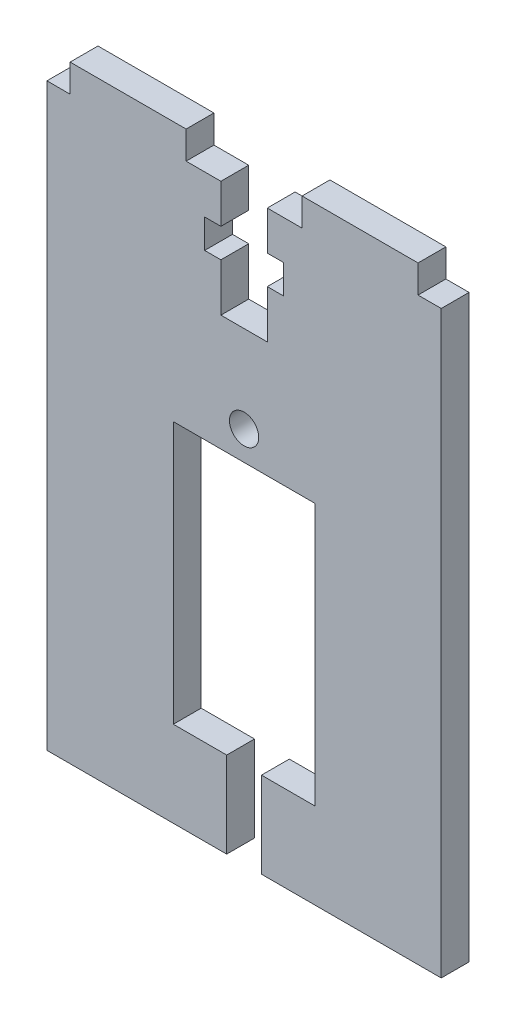
ISO-10303-21;
HEADER;
FILE_DESCRIPTION(('STEP AP214'),'2;1');
FILE_NAME('part.step','',(''),(''),'','','');
FILE_SCHEMA(('AUTOMOTIVE_DESIGN { 1 0 10303 214 1 1 1 1 }'));
ENDSEC;
DATA;
#1=APPLICATION_CONTEXT('core data for automotive mechanical design processes');
#2=APPLICATION_PROTOCOL_DEFINITION('international standard','automotive_design',2000,#1);
#3=PRODUCT_CONTEXT('',#1,'mechanical');
#4=PRODUCT('Part','Part','',(#3));
#5=PRODUCT_RELATED_PRODUCT_CATEGORY('part','',(#4));
#6=PRODUCT_DEFINITION_FORMATION('','',#4);
#7=PRODUCT_DEFINITION_CONTEXT('part definition',#1,'design');
#8=PRODUCT_DEFINITION('design','',#6,#7);
#9=PRODUCT_DEFINITION_SHAPE('','',#8);
#10=(LENGTH_UNIT() NAMED_UNIT(*) SI_UNIT(.MILLI.,.METRE.));
#11=(NAMED_UNIT(*) PLANE_ANGLE_UNIT() SI_UNIT($,.RADIAN.));
#12=(NAMED_UNIT(*) SI_UNIT($,.STERADIAN.) SOLID_ANGLE_UNIT());
#13=UNCERTAINTY_MEASURE_WITH_UNIT(LENGTH_MEASURE(1.E-05),#10,'distance_accuracy_value','');
#14=(GEOMETRIC_REPRESENTATION_CONTEXT(3) GLOBAL_UNCERTAINTY_ASSIGNED_CONTEXT((#13)) GLOBAL_UNIT_ASSIGNED_CONTEXT((#10,
#11,#12)) REPRESENTATION_CONTEXT('',''));
#15=CARTESIAN_POINT('',(0.,0.,0.));
#16=DIRECTION('',(0.,0.,1.));
#17=DIRECTION('',(1.,0.,0.));
#18=AXIS2_PLACEMENT_3D('',#15,#16,#17);
#19=CARTESIAN_POINT('',(-6.1,0.,2.4));
#20=DIRECTION('',(-1.,0.,0.));
#21=DIRECTION('',(0.,0.,1.));
#22=AXIS2_PLACEMENT_3D('',#19,#20,#21);
#23=PLANE('',#22);
#24=DIRECTION('',(0.,1.,0.));
#25=VECTOR('',#24,1.);
#26=CARTESIAN_POINT('',(-6.1,0.,0.));
#27=LINE('',#26,#25);
#28=CARTESIAN_POINT('',(-6.1,-17.0284156869604,0.));
#29=VERTEX_POINT('',#28);
#30=CARTESIAN_POINT('',(-6.1,5.57158431303957,0.));
#31=VERTEX_POINT('',#30);
#32=EDGE_CURVE('E277',#29,#31,#27,.T.);
#33=ORIENTED_EDGE('',*,*,#32,.T.);
#34=DIRECTION('',(0.,0.,-1.));
#35=VECTOR('',#34,1.);
#36=CARTESIAN_POINT('',(-6.1,5.57158431303957,2.4));
#37=LINE('',#36,#35);
#38=CARTESIAN_POINT('',(-6.1,5.57158431303957,2.4));
#39=VERTEX_POINT('',#38);
#40=EDGE_CURVE('E11',#39,#31,#37,.T.);
#41=ORIENTED_EDGE('',*,*,#40,.F.);
#42=DIRECTION('',(0.,1.,0.));
#43=VECTOR('',#42,1.);
#44=CARTESIAN_POINT('',(-6.1,0.,2.4));
#45=LINE('',#44,#43);
#46=CARTESIAN_POINT('',(-6.1,-17.0284156869604,2.4));
#47=VERTEX_POINT('',#46);
#48=EDGE_CURVE('E360',#47,#39,#45,.T.);
#49=ORIENTED_EDGE('',*,*,#48,.F.);
#50=DIRECTION('',(0.,0.,-1.));
#51=VECTOR('',#50,1.);
#52=CARTESIAN_POINT('',(-6.1,-17.0284156869604,2.4));
#53=LINE('',#52,#51);
#54=EDGE_CURVE('E276',#47,#29,#53,.T.);
#55=ORIENTED_EDGE('',*,*,#54,.T.);
#56=EDGE_LOOP('',(#33,#41,#49,#55));
#57=FACE_BOUND('',#56,.T.);
#58=ADVANCED_FACE('F35',(#57),#23,.F.);
#59=CARTESIAN_POINT('',(0.,5.57158431303957,2.4));
#60=DIRECTION('',(0.,1.,0.));
#61=DIRECTION('',(0.,0.,1.));
#62=AXIS2_PLACEMENT_3D('',#59,#60,#61);
#63=PLANE('',#62);
#64=DIRECTION('',(1.,0.,0.));
#65=VECTOR('',#64,1.);
#66=CARTESIAN_POINT('',(0.,5.57158431303957,0.));
#67=LINE('',#66,#65);
#68=CARTESIAN_POINT('',(6.1,5.57158431303957,0.));
#69=VERTEX_POINT('',#68);
#70=EDGE_CURVE('E280',#31,#69,#67,.T.);
#71=ORIENTED_EDGE('',*,*,#70,.T.);
#72=DIRECTION('',(0.,0.,-1.));
#73=VECTOR('',#72,1.);
#74=CARTESIAN_POINT('',(6.1,5.57158431303957,2.4));
#75=LINE('',#74,#73);
#76=CARTESIAN_POINT('',(6.1,5.57158431303957,2.4));
#77=VERTEX_POINT('',#76);
#78=EDGE_CURVE('E43',#77,#69,#75,.T.);
#79=ORIENTED_EDGE('',*,*,#78,.F.);
#80=DIRECTION('',(1.,0.,0.));
#81=VECTOR('',#80,1.);
#82=CARTESIAN_POINT('',(0.,5.57158431303957,2.4));
#83=LINE('',#82,#81);
#84=EDGE_CURVE('E162',#39,#77,#83,.T.);
#85=ORIENTED_EDGE('',*,*,#84,.F.);
#86=ORIENTED_EDGE('',*,*,#40,.T.);
#87=EDGE_LOOP('',(#71,#79,#85,#86));
#88=FACE_BOUND('',#87,.T.);
#89=ADVANCED_FACE('F528',(#88),#63,.F.);
#90=CARTESIAN_POINT('',(6.1,0.,2.4));
#91=DIRECTION('',(1.,0.,0.));
#92=DIRECTION('',(0.,1.,0.));
#93=AXIS2_PLACEMENT_3D('',#90,#91,#92);
#94=PLANE('',#93);
#95=DIRECTION('',(0.,-1.,0.));
#96=VECTOR('',#95,1.);
#97=CARTESIAN_POINT('',(6.1,0.,0.));
#98=LINE('',#97,#96);
#99=CARTESIAN_POINT('',(6.1,-17.0284156869604,0.));
#100=VERTEX_POINT('',#99);
#101=EDGE_CURVE('E282',#69,#100,#98,.T.);
#102=ORIENTED_EDGE('',*,*,#101,.T.);
#103=DIRECTION('',(0.,0.,-1.));
#104=VECTOR('',#103,1.);
#105=CARTESIAN_POINT('',(6.1,-17.0284156869604,2.4));
#106=LINE('',#105,#104);
#107=CARTESIAN_POINT('',(6.1,-17.0284156869604,2.4));
#108=VERTEX_POINT('',#107);
#109=EDGE_CURVE('E423',#108,#100,#106,.T.);
#110=ORIENTED_EDGE('',*,*,#109,.F.);
#111=DIRECTION('',(0.,-1.,0.));
#112=VECTOR('',#111,1.);
#113=CARTESIAN_POINT('',(6.1,0.,2.4));
#114=LINE('',#113,#112);
#115=EDGE_CURVE('E431',#77,#108,#114,.T.);
#116=ORIENTED_EDGE('',*,*,#115,.F.);
#117=ORIENTED_EDGE('',*,*,#78,.T.);
#118=EDGE_LOOP('',(#102,#110,#116,#117));
#119=FACE_BOUND('',#118,.T.);
#120=ADVANCED_FACE('F429',(#119),#94,.F.);
#121=CARTESIAN_POINT('',(0.,-17.0284156869604,2.4));
#122=DIRECTION('',(0.,-1.,0.));
#123=DIRECTION('',(1.,0.,0.));
#124=AXIS2_PLACEMENT_3D('',#121,#122,#123);
#125=PLANE('',#124);
#126=DIRECTION('',(-1.,0.,0.));
#127=VECTOR('',#126,1.);
#128=CARTESIAN_POINT('',(0.,-17.0284156869604,0.));
#129=LINE('',#128,#127);
#130=CARTESIAN_POINT('',(1.5,-17.0284156869604,0.));
#131=VERTEX_POINT('',#130);
#132=EDGE_CURVE('E284',#100,#131,#129,.T.);
#133=ORIENTED_EDGE('',*,*,#132,.T.);
#134=DIRECTION('',(0.,0.,-1.));
#135=VECTOR('',#134,1.);
#136=CARTESIAN_POINT('',(1.5,-17.0284156869604,2.4));
#137=LINE('',#136,#135);
#138=CARTESIAN_POINT('',(1.5,-17.0284156869604,2.4));
#139=VERTEX_POINT('',#138);
#140=EDGE_CURVE('E420',#139,#131,#137,.T.);
#141=ORIENTED_EDGE('',*,*,#140,.F.);
#142=DIRECTION('',(-1.,0.,0.));
#143=VECTOR('',#142,1.);
#144=CARTESIAN_POINT('',(0.,-17.0284156869604,2.4));
#145=LINE('',#144,#143);
#146=EDGE_CURVE('E450',#108,#139,#145,.T.);
#147=ORIENTED_EDGE('',*,*,#146,.F.);
#148=ORIENTED_EDGE('',*,*,#109,.T.);
#149=EDGE_LOOP('',(#133,#141,#147,#148));
#150=FACE_BOUND('',#149,.T.);
#151=ADVANCED_FACE('F441',(#150),#125,.F.);
#152=CARTESIAN_POINT('',(1.5,0.,2.4));
#153=DIRECTION('',(1.,0.,0.));
#154=DIRECTION('',(0.,0.,-1.));
#155=AXIS2_PLACEMENT_3D('',#152,#153,#154);
#156=PLANE('',#155);
#157=DIRECTION('',(0.,-1.,0.));
#158=VECTOR('',#157,1.);
#159=CARTESIAN_POINT('',(1.5,0.,0.));
#160=LINE('',#159,#158);
#161=CARTESIAN_POINT('',(1.5,-24.4284156869604,0.));
#162=VERTEX_POINT('',#161);
#163=EDGE_CURVE('E286',#131,#162,#160,.T.);
#164=ORIENTED_EDGE('',*,*,#163,.T.);
#165=DIRECTION('',(0.,0.,-1.));
#166=VECTOR('',#165,1.);
#167=CARTESIAN_POINT('',(1.5,-24.4284156869604,2.4));
#168=LINE('',#167,#166);
#169=CARTESIAN_POINT('',(1.5,-24.4284156869604,2.4));
#170=VERTEX_POINT('',#169);
#171=EDGE_CURVE('E417',#170,#162,#168,.T.);
#172=ORIENTED_EDGE('',*,*,#171,.F.);
#173=DIRECTION('',(0.,-1.,0.));
#174=VECTOR('',#173,1.);
#175=CARTESIAN_POINT('',(1.5,0.,2.4));
#176=LINE('',#175,#174);
#177=EDGE_CURVE('E447',#139,#170,#176,.T.);
#178=ORIENTED_EDGE('',*,*,#177,.F.);
#179=ORIENTED_EDGE('',*,*,#140,.T.);
#180=EDGE_LOOP('',(#164,#172,#178,#179));
#181=FACE_BOUND('',#180,.T.);
#182=ADVANCED_FACE('F445',(#181),#156,.F.);
#183=CARTESIAN_POINT('',(0.,-24.4284156869604,2.4));
#184=DIRECTION('',(0.,1.,0.));
#185=DIRECTION('',(-1.,0.,0.));
#186=AXIS2_PLACEMENT_3D('',#183,#184,#185);
#187=PLANE('',#186);
#188=DIRECTION('',(1.,0.,0.));
#189=VECTOR('',#188,1.);
#190=CARTESIAN_POINT('',(0.,-24.4284156869604,0.));
#191=LINE('',#190,#189);
#192=CARTESIAN_POINT('',(17.,-24.4284156869604,0.));
#193=VERTEX_POINT('',#192);
#194=EDGE_CURVE('E288',#162,#193,#191,.T.);
#195=ORIENTED_EDGE('',*,*,#194,.T.);
#196=DIRECTION('',(0.,0.,-1.));
#197=VECTOR('',#196,1.);
#198=CARTESIAN_POINT('',(17.,-24.4284156869604,2.4));
#199=LINE('',#198,#197);
#200=CARTESIAN_POINT('',(17.,-24.4284156869604,2.4));
#201=VERTEX_POINT('',#200);
#202=EDGE_CURVE('E415',#201,#193,#199,.T.);
#203=ORIENTED_EDGE('',*,*,#202,.F.);
#204=DIRECTION('',(1.,0.,0.));
#205=VECTOR('',#204,1.);
#206=CARTESIAN_POINT('',(0.,-24.4284156869604,2.4));
#207=LINE('',#206,#205);
#208=EDGE_CURVE('E449',#170,#201,#207,.T.);
#209=ORIENTED_EDGE('',*,*,#208,.F.);
#210=ORIENTED_EDGE('',*,*,#171,.T.);
#211=EDGE_LOOP('',(#195,#203,#209,#210));
#212=FACE_BOUND('',#211,.T.);
#213=ADVANCED_FACE('F541',(#212),#187,.F.);
#214=CARTESIAN_POINT('',(17.,0.,2.4));
#215=DIRECTION('',(1.,0.,0.));
#216=DIRECTION('',(0.,1.,0.));
#217=AXIS2_PLACEMENT_3D('',#214,#215,#216);
#218=PLANE('',#217);
#219=DIRECTION('',(0.,-1.,0.));
#220=VECTOR('',#219,1.);
#221=CARTESIAN_POINT('',(17.,0.,0.));
#222=LINE('',#221,#220);
#223=CARTESIAN_POINT('',(17.,25.5715843130396,0.));
#224=VERTEX_POINT('',#223);
#225=EDGE_CURVE('E291',#224,#193,#222,.T.);
#226=ORIENTED_EDGE('',*,*,#225,.F.);
#227=DIRECTION('',(0.,0.,-1.));
#228=VECTOR('',#227,1.);
#229=CARTESIAN_POINT('',(17.,25.5715843130396,2.4));
#230=LINE('',#229,#228);
#231=CARTESIAN_POINT('',(17.,25.5715843130396,2.4));
#232=VERTEX_POINT('',#231);
#233=EDGE_CURVE('E413',#232,#224,#230,.T.);
#234=ORIENTED_EDGE('',*,*,#233,.F.);
#235=DIRECTION('',(0.,-1.,0.));
#236=VECTOR('',#235,1.);
#237=CARTESIAN_POINT('',(17.,0.,2.4));
#238=LINE('',#237,#236);
#239=EDGE_CURVE('E452',#232,#201,#238,.T.);
#240=ORIENTED_EDGE('',*,*,#239,.T.);
#241=ORIENTED_EDGE('',*,*,#202,.T.);
#242=EDGE_LOOP('',(#226,#234,#240,#241));
#243=FACE_BOUND('',#242,.T.);
#244=ADVANCED_FACE('F544',(#243),#218,.T.);
#245=CARTESIAN_POINT('',(0.,25.5715843130396,2.4));
#246=DIRECTION('',(0.,-1.,0.));
#247=DIRECTION('',(0.,0.,-1.));
#248=AXIS2_PLACEMENT_3D('',#245,#246,#247);
#249=PLANE('',#248);
#250=DIRECTION('',(-1.,0.,0.));
#251=VECTOR('',#250,1.);
#252=CARTESIAN_POINT('',(0.,25.5715843130396,0.));
#253=LINE('',#252,#251);
#254=CARTESIAN_POINT('',(15.,25.5715843130396,0.));
#255=VERTEX_POINT('',#254);
#256=EDGE_CURVE('E294',#224,#255,#253,.T.);
#257=ORIENTED_EDGE('',*,*,#256,.T.);
#258=DIRECTION('',(0.,0.,-1.));
#259=VECTOR('',#258,1.);
#260=CARTESIAN_POINT('',(15.,25.5715843130396,2.4));
#261=LINE('',#260,#259);
#262=CARTESIAN_POINT('',(15.,25.5715843130396,2.4));
#263=VERTEX_POINT('',#262);
#264=EDGE_CURVE('E410',#263,#255,#261,.T.);
#265=ORIENTED_EDGE('',*,*,#264,.F.);
#266=DIRECTION('',(-1.,0.,0.));
#267=VECTOR('',#266,1.);
#268=CARTESIAN_POINT('',(0.,25.5715843130396,2.4));
#269=LINE('',#268,#267);
#270=EDGE_CURVE('E459',#232,#263,#269,.T.);
#271=ORIENTED_EDGE('',*,*,#270,.F.);
#272=ORIENTED_EDGE('',*,*,#233,.T.);
#273=EDGE_LOOP('',(#257,#265,#271,#272));
#274=FACE_BOUND('',#273,.T.);
#275=ADVANCED_FACE('F548',(#274),#249,.F.);
#276=CARTESIAN_POINT('',(15.,0.,2.4));
#277=DIRECTION('',(-1.,0.,0.));
#278=DIRECTION('',(0.,0.,1.));
#279=AXIS2_PLACEMENT_3D('',#276,#277,#278);
#280=PLANE('',#279);
#281=DIRECTION('',(0.,1.,0.));
#282=VECTOR('',#281,1.);
#283=CARTESIAN_POINT('',(15.,0.,0.));
#284=LINE('',#283,#282);
#285=CARTESIAN_POINT('',(15.,27.9715843130396,0.));
#286=VERTEX_POINT('',#285);
#287=EDGE_CURVE('E296',#255,#286,#284,.T.);
#288=ORIENTED_EDGE('',*,*,#287,.T.);
#289=DIRECTION('',(0.,0.,-1.));
#290=VECTOR('',#289,1.);
#291=CARTESIAN_POINT('',(15.,27.9715843130396,2.4));
#292=LINE('',#291,#290);
#293=CARTESIAN_POINT('',(15.,27.9715843130396,2.4));
#294=VERTEX_POINT('',#293);
#295=EDGE_CURVE('E407',#294,#286,#292,.T.);
#296=ORIENTED_EDGE('',*,*,#295,.F.);
#297=DIRECTION('',(0.,1.,0.));
#298=VECTOR('',#297,1.);
#299=CARTESIAN_POINT('',(15.,0.,2.4));
#300=LINE('',#299,#298);
#301=EDGE_CURVE('E461',#263,#294,#300,.T.);
#302=ORIENTED_EDGE('',*,*,#301,.F.);
#303=ORIENTED_EDGE('',*,*,#264,.T.);
#304=EDGE_LOOP('',(#288,#296,#302,#303));
#305=FACE_BOUND('',#304,.T.);
#306=ADVANCED_FACE('F552',(#305),#280,.F.);
#307=CARTESIAN_POINT('',(0.,27.9715843130396,2.4));
#308=DIRECTION('',(0.,-1.,0.));
#309=DIRECTION('',(1.,0.,0.));
#310=AXIS2_PLACEMENT_3D('',#307,#308,#309);
#311=PLANE('',#310);
#312=DIRECTION('',(-1.,0.,0.));
#313=VECTOR('',#312,1.);
#314=CARTESIAN_POINT('',(0.,27.9715843130396,0.));
#315=LINE('',#314,#313);
#316=CARTESIAN_POINT('',(5.,27.9715843130396,0.));
#317=VERTEX_POINT('',#316);
#318=EDGE_CURVE('E298',#286,#317,#315,.T.);
#319=ORIENTED_EDGE('',*,*,#318,.T.);
#320=DIRECTION('',(0.,0.,-1.));
#321=VECTOR('',#320,1.);
#322=CARTESIAN_POINT('',(5.,27.9715843130396,2.4));
#323=LINE('',#322,#321);
#324=CARTESIAN_POINT('',(5.,27.9715843130396,2.4));
#325=VERTEX_POINT('',#324);
#326=EDGE_CURVE('E405',#325,#317,#323,.T.);
#327=ORIENTED_EDGE('',*,*,#326,.F.);
#328=DIRECTION('',(-1.,0.,0.));
#329=VECTOR('',#328,1.);
#330=CARTESIAN_POINT('',(0.,27.9715843130396,2.4));
#331=LINE('',#330,#329);
#332=EDGE_CURVE('E463',#294,#325,#331,.T.);
#333=ORIENTED_EDGE('',*,*,#332,.F.);
#334=ORIENTED_EDGE('',*,*,#295,.T.);
#335=EDGE_LOOP('',(#319,#327,#333,#334));
#336=FACE_BOUND('',#335,.T.);
#337=ADVANCED_FACE('F556',(#336),#311,.F.);
#338=CARTESIAN_POINT('',(5.00000000000002,0.,2.4));
#339=DIRECTION('',(-1.,0.,0.));
#340=DIRECTION('',(0.,-1.,0.));
#341=AXIS2_PLACEMENT_3D('',#338,#339,#340);
#342=PLANE('',#341);
#343=DIRECTION('',(0.,1.,0.));
#344=VECTOR('',#343,1.);
#345=CARTESIAN_POINT('',(5.00000000000002,0.,0.));
#346=LINE('',#345,#344);
#347=CARTESIAN_POINT('',(5.,25.5715843130396,0.));
#348=VERTEX_POINT('',#347);
#349=EDGE_CURVE('E301',#348,#317,#346,.T.);
#350=ORIENTED_EDGE('',*,*,#349,.F.);
#351=DIRECTION('',(0.,0.,-1.));
#352=VECTOR('',#351,1.);
#353=CARTESIAN_POINT('',(5.,25.5715843130396,2.4));
#354=LINE('',#353,#352);
#355=CARTESIAN_POINT('',(5.,25.5715843130396,2.4));
#356=VERTEX_POINT('',#355);
#357=EDGE_CURVE('E403',#356,#348,#354,.T.);
#358=ORIENTED_EDGE('',*,*,#357,.F.);
#359=DIRECTION('',(0.,1.,0.));
#360=VECTOR('',#359,1.);
#361=CARTESIAN_POINT('',(5.00000000000002,0.,2.4));
#362=LINE('',#361,#360);
#363=EDGE_CURVE('E465',#356,#325,#362,.T.);
#364=ORIENTED_EDGE('',*,*,#363,.T.);
#365=ORIENTED_EDGE('',*,*,#326,.T.);
#366=EDGE_LOOP('',(#350,#358,#364,#365));
#367=FACE_BOUND('',#366,.T.);
#368=ADVANCED_FACE('F560',(#367),#342,.T.);
#369=CARTESIAN_POINT('',(0.,25.5715843130396,2.4));
#370=DIRECTION('',(0.,-1.,0.));
#371=DIRECTION('',(1.,0.,0.));
#372=AXIS2_PLACEMENT_3D('',#369,#370,#371);
#373=PLANE('',#372);
#374=DIRECTION('',(-1.,0.,0.));
#375=VECTOR('',#374,1.);
#376=CARTESIAN_POINT('',(0.,25.5715843130396,0.));
#377=LINE('',#376,#375);
#378=CARTESIAN_POINT('',(2.,25.5715843130396,0.));
#379=VERTEX_POINT('',#378);
#380=EDGE_CURVE('E304',#348,#379,#377,.T.);
#381=ORIENTED_EDGE('',*,*,#380,.T.);
#382=DIRECTION('',(0.,0.,-1.));
#383=VECTOR('',#382,1.);
#384=CARTESIAN_POINT('',(2.,25.5715843130396,2.4));
#385=LINE('',#384,#383);
#386=CARTESIAN_POINT('',(2.,25.5715843130396,2.4));
#387=VERTEX_POINT('',#386);
#388=EDGE_CURVE('E400',#387,#379,#385,.T.);
#389=ORIENTED_EDGE('',*,*,#388,.F.);
#390=DIRECTION('',(-1.,0.,0.));
#391=VECTOR('',#390,1.);
#392=CARTESIAN_POINT('',(0.,25.5715843130396,2.4));
#393=LINE('',#392,#391);
#394=EDGE_CURVE('E468',#356,#387,#393,.T.);
#395=ORIENTED_EDGE('',*,*,#394,.F.);
#396=ORIENTED_EDGE('',*,*,#357,.T.);
#397=EDGE_LOOP('',(#381,#389,#395,#396));
#398=FACE_BOUND('',#397,.T.);
#399=ADVANCED_FACE('F564',(#398),#373,.F.);
#400=CARTESIAN_POINT('',(2.00000000000001,0.,2.4));
#401=DIRECTION('',(1.,0.,0.));
#402=DIRECTION('',(0.,1.,0.));
#403=AXIS2_PLACEMENT_3D('',#400,#401,#402);
#404=PLANE('',#403);
#405=DIRECTION('',(0.,-1.,0.));
#406=VECTOR('',#405,1.);
#407=CARTESIAN_POINT('',(2.00000000000001,0.,0.));
#408=LINE('',#407,#406);
#409=CARTESIAN_POINT('',(2.,22.2048061684257,0.));
#410=VERTEX_POINT('',#409);
#411=EDGE_CURVE('E306',#379,#410,#408,.T.);
#412=ORIENTED_EDGE('',*,*,#411,.T.);
#413=DIRECTION('',(0.,0.,-1.));
#414=VECTOR('',#413,1.);
#415=CARTESIAN_POINT('',(2.,22.2048061684257,2.4));
#416=LINE('',#415,#414);
#417=CARTESIAN_POINT('',(2.,22.2048061684257,2.4));
#418=VERTEX_POINT('',#417);
#419=EDGE_CURVE('E398',#418,#410,#416,.T.);
#420=ORIENTED_EDGE('',*,*,#419,.F.);
#421=DIRECTION('',(0.,-1.,0.));
#422=VECTOR('',#421,1.);
#423=CARTESIAN_POINT('',(2.00000000000001,0.,2.4));
#424=LINE('',#423,#422);
#425=EDGE_CURVE('E470',#387,#418,#424,.T.);
#426=ORIENTED_EDGE('',*,*,#425,.F.);
#427=ORIENTED_EDGE('',*,*,#388,.T.);
#428=EDGE_LOOP('',(#412,#420,#426,#427));
#429=FACE_BOUND('',#428,.T.);
#430=ADVANCED_FACE('F568',(#429),#404,.F.);
#431=CARTESIAN_POINT('',(0.,22.2048061684257,2.4));
#432=DIRECTION('',(0.,-1.,0.));
#433=DIRECTION('',(0.,0.,-1.));
#434=AXIS2_PLACEMENT_3D('',#431,#432,#433);
#435=PLANE('',#434);
#436=DIRECTION('',(-1.,0.,0.));
#437=VECTOR('',#436,1.);
#438=CARTESIAN_POINT('',(0.,22.2048061684257,0.));
#439=LINE('',#438,#437);
#440=CARTESIAN_POINT('',(3.4,22.2048061684257,0.));
#441=VERTEX_POINT('',#440);
#442=EDGE_CURVE('E309',#441,#410,#439,.T.);
#443=ORIENTED_EDGE('',*,*,#442,.F.);
#444=DIRECTION('',(0.,0.,-1.));
#445=VECTOR('',#444,1.);
#446=CARTESIAN_POINT('',(3.4,22.2048061684257,2.4));
#447=LINE('',#446,#445);
#448=CARTESIAN_POINT('',(3.4,22.2048061684257,2.4));
#449=VERTEX_POINT('',#448);
#450=EDGE_CURVE('E396',#449,#441,#447,.T.);
#451=ORIENTED_EDGE('',*,*,#450,.F.);
#452=DIRECTION('',(-1.,0.,0.));
#453=VECTOR('',#452,1.);
#454=CARTESIAN_POINT('',(0.,22.2048061684257,2.4));
#455=LINE('',#454,#453);
#456=EDGE_CURVE('E472',#449,#418,#455,.T.);
#457=ORIENTED_EDGE('',*,*,#456,.T.);
#458=ORIENTED_EDGE('',*,*,#419,.T.);
#459=EDGE_LOOP('',(#443,#451,#457,#458));
#460=FACE_BOUND('',#459,.T.);
#461=ADVANCED_FACE('F572',(#460),#435,.T.);
#462=CARTESIAN_POINT('',(3.4,0.,2.4));
#463=DIRECTION('',(1.,0.,0.));
#464=DIRECTION('',(0.,1.,0.));
#465=AXIS2_PLACEMENT_3D('',#462,#463,#464);
#466=PLANE('',#465);
#467=DIRECTION('',(0.,-1.,0.));
#468=VECTOR('',#467,1.);
#469=CARTESIAN_POINT('',(3.4,0.,0.));
#470=LINE('',#469,#468);
#471=CARTESIAN_POINT('',(3.4,19.7048061684257,0.));
#472=VERTEX_POINT('',#471);
#473=EDGE_CURVE('E312',#441,#472,#470,.T.);
#474=ORIENTED_EDGE('',*,*,#473,.T.);
#475=DIRECTION('',(0.,0.,-1.));
#476=VECTOR('',#475,1.);
#477=CARTESIAN_POINT('',(3.4,19.7048061684257,2.4));
#478=LINE('',#477,#476);
#479=CARTESIAN_POINT('',(3.4,19.7048061684257,2.4));
#480=VERTEX_POINT('',#479);
#481=EDGE_CURVE('E393',#480,#472,#478,.T.);
#482=ORIENTED_EDGE('',*,*,#481,.F.);
#483=DIRECTION('',(0.,-1.,0.));
#484=VECTOR('',#483,1.);
#485=CARTESIAN_POINT('',(3.4,0.,2.4));
#486=LINE('',#485,#484);
#487=EDGE_CURVE('E475',#449,#480,#486,.T.);
#488=ORIENTED_EDGE('',*,*,#487,.F.);
#489=ORIENTED_EDGE('',*,*,#450,.T.);
#490=EDGE_LOOP('',(#474,#482,#488,#489));
#491=FACE_BOUND('',#490,.T.);
#492=ADVANCED_FACE('F576',(#491),#466,.F.);
#493=CARTESIAN_POINT('',(0.,19.7048061684257,2.4));
#494=DIRECTION('',(0.,-1.,0.));
#495=DIRECTION('',(0.,0.,-1.));
#496=AXIS2_PLACEMENT_3D('',#493,#494,#495);
#497=PLANE('',#496);
#498=DIRECTION('',(-1.,0.,0.));
#499=VECTOR('',#498,1.);
#500=CARTESIAN_POINT('',(0.,19.7048061684257,0.));
#501=LINE('',#500,#499);
#502=CARTESIAN_POINT('',(2.,19.7048061684257,0.));
#503=VERTEX_POINT('',#502);
#504=EDGE_CURVE('E314',#472,#503,#501,.T.);
#505=ORIENTED_EDGE('',*,*,#504,.T.);
#506=DIRECTION('',(0.,0.,-1.));
#507=VECTOR('',#506,1.);
#508=CARTESIAN_POINT('',(2.,19.7048061684257,2.4));
#509=LINE('',#508,#507);
#510=CARTESIAN_POINT('',(2.,19.7048061684257,2.4));
#511=VERTEX_POINT('',#510);
#512=EDGE_CURVE('E390',#511,#503,#509,.T.);
#513=ORIENTED_EDGE('',*,*,#512,.F.);
#514=DIRECTION('',(-1.,0.,0.));
#515=VECTOR('',#514,1.);
#516=CARTESIAN_POINT('',(0.,19.7048061684257,2.4));
#517=LINE('',#516,#515);
#518=EDGE_CURVE('E477',#480,#511,#517,.T.);
#519=ORIENTED_EDGE('',*,*,#518,.F.);
#520=ORIENTED_EDGE('',*,*,#481,.T.);
#521=EDGE_LOOP('',(#505,#513,#519,#520));
#522=FACE_BOUND('',#521,.T.);
#523=ADVANCED_FACE('F580',(#522),#497,.F.);
#524=CARTESIAN_POINT('',(2.00000000000001,0.,2.4));
#525=DIRECTION('',(1.,0.,0.));
#526=DIRECTION('',(0.,1.,0.));
#527=AXIS2_PLACEMENT_3D('',#524,#525,#526);
#528=PLANE('',#527);
#529=DIRECTION('',(0.,-1.,0.));
#530=VECTOR('',#529,1.);
#531=CARTESIAN_POINT('',(2.00000000000001,0.,0.));
#532=LINE('',#531,#530);
#533=CARTESIAN_POINT('',(2.,15.5715843130396,0.));
#534=VERTEX_POINT('',#533);
#535=EDGE_CURVE('E316',#503,#534,#532,.T.);
#536=ORIENTED_EDGE('',*,*,#535,.T.);
#537=DIRECTION('',(0.,0.,-1.));
#538=VECTOR('',#537,1.);
#539=CARTESIAN_POINT('',(2.,15.5715843130396,2.4));
#540=LINE('',#539,#538);
#541=CARTESIAN_POINT('',(2.,15.5715843130396,2.4));
#542=VERTEX_POINT('',#541);
#543=EDGE_CURVE('E387',#542,#534,#540,.T.);
#544=ORIENTED_EDGE('',*,*,#543,.F.);
#545=DIRECTION('',(0.,-1.,0.));
#546=VECTOR('',#545,1.);
#547=CARTESIAN_POINT('',(2.00000000000001,0.,2.4));
#548=LINE('',#547,#546);
#549=EDGE_CURVE('E479',#511,#542,#548,.T.);
#550=ORIENTED_EDGE('',*,*,#549,.F.);
#551=ORIENTED_EDGE('',*,*,#512,.T.);
#552=EDGE_LOOP('',(#536,#544,#550,#551));
#553=FACE_BOUND('',#552,.T.);
#554=ADVANCED_FACE('F584',(#553),#528,.F.);
#555=CARTESIAN_POINT('',(0.,15.5715843130396,2.4));
#556=DIRECTION('',(0.,-1.,0.));
#557=DIRECTION('',(0.,0.,-1.));
#558=AXIS2_PLACEMENT_3D('',#555,#556,#557);
#559=PLANE('',#558);
#560=DIRECTION('',(-1.,0.,0.));
#561=VECTOR('',#560,1.);
#562=CARTESIAN_POINT('',(0.,15.5715843130396,0.));
#563=LINE('',#562,#561);
#564=CARTESIAN_POINT('',(-2.,15.5715843130396,0.));
#565=VERTEX_POINT('',#564);
#566=EDGE_CURVE('E318',#534,#565,#563,.T.);
#567=ORIENTED_EDGE('',*,*,#566,.T.);
#568=DIRECTION('',(0.,0.,-1.));
#569=VECTOR('',#568,1.);
#570=CARTESIAN_POINT('',(-2.,15.5715843130396,2.4));
#571=LINE('',#570,#569);
#572=CARTESIAN_POINT('',(-2.,15.5715843130396,2.4));
#573=VERTEX_POINT('',#572);
#574=EDGE_CURVE('E385',#573,#565,#571,.T.);
#575=ORIENTED_EDGE('',*,*,#574,.F.);
#576=DIRECTION('',(-1.,0.,0.));
#577=VECTOR('',#576,1.);
#578=CARTESIAN_POINT('',(0.,15.5715843130396,2.4));
#579=LINE('',#578,#577);
#580=EDGE_CURVE('E481',#542,#573,#579,.T.);
#581=ORIENTED_EDGE('',*,*,#580,.F.);
#582=ORIENTED_EDGE('',*,*,#543,.T.);
#583=EDGE_LOOP('',(#567,#575,#581,#582));
#584=FACE_BOUND('',#583,.T.);
#585=ADVANCED_FACE('F588',(#584),#559,.F.);
#586=CARTESIAN_POINT('',(-1.99999999999999,0.,2.4));
#587=DIRECTION('',(1.,0.,0.));
#588=DIRECTION('',(0.,1.,0.));
#589=AXIS2_PLACEMENT_3D('',#586,#587,#588);
#590=PLANE('',#589);
#591=DIRECTION('',(0.,-1.,0.));
#592=VECTOR('',#591,1.);
#593=CARTESIAN_POINT('',(-1.99999999999999,0.,0.));
#594=LINE('',#593,#592);
#595=CARTESIAN_POINT('',(-2.,19.7048061684257,0.));
#596=VERTEX_POINT('',#595);
#597=EDGE_CURVE('E321',#596,#565,#594,.T.);
#598=ORIENTED_EDGE('',*,*,#597,.F.);
#599=DIRECTION('',(0.,0.,-1.));
#600=VECTOR('',#599,1.);
#601=CARTESIAN_POINT('',(-2.,19.7048061684257,2.4));
#602=LINE('',#601,#600);
#603=CARTESIAN_POINT('',(-2.,19.7048061684257,2.4));
#604=VERTEX_POINT('',#603);
#605=EDGE_CURVE('E383',#604,#596,#602,.T.);
#606=ORIENTED_EDGE('',*,*,#605,.F.);
#607=DIRECTION('',(0.,-1.,0.));
#608=VECTOR('',#607,1.);
#609=CARTESIAN_POINT('',(-1.99999999999999,0.,2.4));
#610=LINE('',#609,#608);
#611=EDGE_CURVE('E483',#604,#573,#610,.T.);
#612=ORIENTED_EDGE('',*,*,#611,.T.);
#613=ORIENTED_EDGE('',*,*,#574,.T.);
#614=EDGE_LOOP('',(#598,#606,#612,#613));
#615=FACE_BOUND('',#614,.T.);
#616=ADVANCED_FACE('F592',(#615),#590,.T.);
#617=CARTESIAN_POINT('',(0.,19.7048061684257,2.4));
#618=DIRECTION('',(0.,-1.,0.));
#619=DIRECTION('',(0.,0.,-1.));
#620=AXIS2_PLACEMENT_3D('',#617,#618,#619);
#621=PLANE('',#620);
#622=DIRECTION('',(-1.,0.,0.));
#623=VECTOR('',#622,1.);
#624=CARTESIAN_POINT('',(0.,19.7048061684257,0.));
#625=LINE('',#624,#623);
#626=CARTESIAN_POINT('',(-3.4,19.7048061684257,0.));
#627=VERTEX_POINT('',#626);
#628=EDGE_CURVE('E324',#596,#627,#625,.T.);
#629=ORIENTED_EDGE('',*,*,#628,.T.);
#630=DIRECTION('',(0.,0.,-1.));
#631=VECTOR('',#630,1.);
#632=CARTESIAN_POINT('',(-3.4,19.7048061684257,2.4));
#633=LINE('',#632,#631);
#634=CARTESIAN_POINT('',(-3.4,19.7048061684257,2.4));
#635=VERTEX_POINT('',#634);
#636=EDGE_CURVE('E381',#635,#627,#633,.T.);
#637=ORIENTED_EDGE('',*,*,#636,.F.);
#638=DIRECTION('',(-1.,0.,0.));
#639=VECTOR('',#638,1.);
#640=CARTESIAN_POINT('',(0.,19.7048061684257,2.4));
#641=LINE('',#640,#639);
#642=EDGE_CURVE('E486',#604,#635,#641,.T.);
#643=ORIENTED_EDGE('',*,*,#642,.F.);
#644=ORIENTED_EDGE('',*,*,#605,.T.);
#645=EDGE_LOOP('',(#629,#637,#643,#644));
#646=FACE_BOUND('',#645,.T.);
#647=ADVANCED_FACE('F596',(#646),#621,.F.);
#648=CARTESIAN_POINT('',(-3.4,0.,2.4));
#649=DIRECTION('',(1.,0.,0.));
#650=DIRECTION('',(0.,1.,0.));
#651=AXIS2_PLACEMENT_3D('',#648,#649,#650);
#652=PLANE('',#651);
#653=DIRECTION('',(0.,-1.,0.));
#654=VECTOR('',#653,1.);
#655=CARTESIAN_POINT('',(-3.4,0.,0.));
#656=LINE('',#655,#654);
#657=CARTESIAN_POINT('',(-3.4,22.2048061684257,0.));
#658=VERTEX_POINT('',#657);
#659=EDGE_CURVE('E327',#658,#627,#656,.T.);
#660=ORIENTED_EDGE('',*,*,#659,.F.);
#661=DIRECTION('',(0.,0.,-1.));
#662=VECTOR('',#661,1.);
#663=CARTESIAN_POINT('',(-3.4,22.2048061684257,2.4));
#664=LINE('',#663,#662);
#665=CARTESIAN_POINT('',(-3.4,22.2048061684257,2.4));
#666=VERTEX_POINT('',#665);
#667=EDGE_CURVE('E379',#666,#658,#664,.T.);
#668=ORIENTED_EDGE('',*,*,#667,.F.);
#669=DIRECTION('',(0.,-1.,0.));
#670=VECTOR('',#669,1.);
#671=CARTESIAN_POINT('',(-3.4,0.,2.4));
#672=LINE('',#671,#670);
#673=EDGE_CURVE('E488',#666,#635,#672,.T.);
#674=ORIENTED_EDGE('',*,*,#673,.T.);
#675=ORIENTED_EDGE('',*,*,#636,.T.);
#676=EDGE_LOOP('',(#660,#668,#674,#675));
#677=FACE_BOUND('',#676,.T.);
#678=ADVANCED_FACE('F600',(#677),#652,.T.);
#679=CARTESIAN_POINT('',(0.,22.2048061684257,2.4));
#680=DIRECTION('',(0.,-1.,0.));
#681=DIRECTION('',(0.,0.,-1.));
#682=AXIS2_PLACEMENT_3D('',#679,#680,#681);
#683=PLANE('',#682);
#684=DIRECTION('',(-1.,0.,0.));
#685=VECTOR('',#684,1.);
#686=CARTESIAN_POINT('',(0.,22.2048061684257,0.));
#687=LINE('',#686,#685);
#688=CARTESIAN_POINT('',(-2.,22.2048061684257,0.));
#689=VERTEX_POINT('',#688);
#690=EDGE_CURVE('E330',#689,#658,#687,.T.);
#691=ORIENTED_EDGE('',*,*,#690,.F.);
#692=DIRECTION('',(0.,0.,-1.));
#693=VECTOR('',#692,1.);
#694=CARTESIAN_POINT('',(-2.,22.2048061684257,2.4));
#695=LINE('',#694,#693);
#696=CARTESIAN_POINT('',(-2.,22.2048061684257,2.4));
#697=VERTEX_POINT('',#696);
#698=EDGE_CURVE('E377',#697,#689,#695,.T.);
#699=ORIENTED_EDGE('',*,*,#698,.F.);
#700=DIRECTION('',(-1.,0.,0.));
#701=VECTOR('',#700,1.);
#702=CARTESIAN_POINT('',(0.,22.2048061684257,2.4));
#703=LINE('',#702,#701);
#704=EDGE_CURVE('E491',#697,#666,#703,.T.);
#705=ORIENTED_EDGE('',*,*,#704,.T.);
#706=ORIENTED_EDGE('',*,*,#667,.T.);
#707=EDGE_LOOP('',(#691,#699,#705,#706));
#708=FACE_BOUND('',#707,.T.);
#709=ADVANCED_FACE('F604',(#708),#683,.T.);
#710=CARTESIAN_POINT('',(-1.99999999999999,0.,2.4));
#711=DIRECTION('',(1.,0.,0.));
#712=DIRECTION('',(0.,1.,0.));
#713=AXIS2_PLACEMENT_3D('',#710,#711,#712);
#714=PLANE('',#713);
#715=DIRECTION('',(0.,-1.,0.));
#716=VECTOR('',#715,1.);
#717=CARTESIAN_POINT('',(-1.99999999999999,0.,0.));
#718=LINE('',#717,#716);
#719=CARTESIAN_POINT('',(-2.,25.5715843130396,0.));
#720=VERTEX_POINT('',#719);
#721=EDGE_CURVE('E333',#720,#689,#718,.T.);
#722=ORIENTED_EDGE('',*,*,#721,.F.);
#723=DIRECTION('',(0.,0.,-1.));
#724=VECTOR('',#723,1.);
#725=CARTESIAN_POINT('',(-2.,25.5715843130396,2.4));
#726=LINE('',#725,#724);
#727=CARTESIAN_POINT('',(-2.,25.5715843130396,2.4));
#728=VERTEX_POINT('',#727);
#729=EDGE_CURVE('E375',#728,#720,#726,.T.);
#730=ORIENTED_EDGE('',*,*,#729,.F.);
#731=DIRECTION('',(0.,-1.,0.));
#732=VECTOR('',#731,1.);
#733=CARTESIAN_POINT('',(-1.99999999999999,0.,2.4));
#734=LINE('',#733,#732);
#735=EDGE_CURVE('E494',#728,#697,#734,.T.);
#736=ORIENTED_EDGE('',*,*,#735,.T.);
#737=ORIENTED_EDGE('',*,*,#698,.T.);
#738=EDGE_LOOP('',(#722,#730,#736,#737));
#739=FACE_BOUND('',#738,.T.);
#740=ADVANCED_FACE('F608',(#739),#714,.T.);
#741=CARTESIAN_POINT('',(0.,25.5715843130396,2.4));
#742=DIRECTION('',(0.,-1.,0.));
#743=DIRECTION('',(1.,0.,0.));
#744=AXIS2_PLACEMENT_3D('',#741,#742,#743);
#745=PLANE('',#744);
#746=DIRECTION('',(-1.,0.,0.));
#747=VECTOR('',#746,1.);
#748=CARTESIAN_POINT('',(0.,25.5715843130396,0.));
#749=LINE('',#748,#747);
#750=CARTESIAN_POINT('',(-5.,25.5715843130396,0.));
#751=VERTEX_POINT('',#750);
#752=EDGE_CURVE('E336',#720,#751,#749,.T.);
#753=ORIENTED_EDGE('',*,*,#752,.T.);
#754=DIRECTION('',(0.,0.,-1.));
#755=VECTOR('',#754,1.);
#756=CARTESIAN_POINT('',(-5.,25.5715843130396,2.4));
#757=LINE('',#756,#755);
#758=CARTESIAN_POINT('',(-5.,25.5715843130396,2.4));
#759=VERTEX_POINT('',#758);
#760=EDGE_CURVE('E372',#759,#751,#757,.T.);
#761=ORIENTED_EDGE('',*,*,#760,.F.);
#762=DIRECTION('',(-1.,0.,0.));
#763=VECTOR('',#762,1.);
#764=CARTESIAN_POINT('',(0.,25.5715843130396,2.4));
#765=LINE('',#764,#763);
#766=EDGE_CURVE('E497',#728,#759,#765,.T.);
#767=ORIENTED_EDGE('',*,*,#766,.F.);
#768=ORIENTED_EDGE('',*,*,#729,.T.);
#769=EDGE_LOOP('',(#753,#761,#767,#768));
#770=FACE_BOUND('',#769,.T.);
#771=ADVANCED_FACE('F612',(#770),#745,.F.);
#772=CARTESIAN_POINT('',(-5.,0.,2.4));
#773=DIRECTION('',(-1.,0.,0.));
#774=DIRECTION('',(0.,0.,1.));
#775=AXIS2_PLACEMENT_3D('',#772,#773,#774);
#776=PLANE('',#775);
#777=DIRECTION('',(0.,1.,0.));
#778=VECTOR('',#777,1.);
#779=CARTESIAN_POINT('',(-5.,0.,0.));
#780=LINE('',#779,#778);
#781=CARTESIAN_POINT('',(-5.,27.9715843130396,0.));
#782=VERTEX_POINT('',#781);
#783=EDGE_CURVE('E338',#751,#782,#780,.T.);
#784=ORIENTED_EDGE('',*,*,#783,.T.);
#785=DIRECTION('',(0.,0.,-1.));
#786=VECTOR('',#785,1.);
#787=CARTESIAN_POINT('',(-5.,27.9715843130396,2.4));
#788=LINE('',#787,#786);
#789=CARTESIAN_POINT('',(-5.,27.9715843130396,2.4));
#790=VERTEX_POINT('',#789);
#791=EDGE_CURVE('E370',#790,#782,#788,.T.);
#792=ORIENTED_EDGE('',*,*,#791,.F.);
#793=DIRECTION('',(0.,1.,0.));
#794=VECTOR('',#793,1.);
#795=CARTESIAN_POINT('',(-5.,0.,2.4));
#796=LINE('',#795,#794);
#797=EDGE_CURVE('E499',#759,#790,#796,.T.);
#798=ORIENTED_EDGE('',*,*,#797,.F.);
#799=ORIENTED_EDGE('',*,*,#760,.T.);
#800=EDGE_LOOP('',(#784,#792,#798,#799));
#801=FACE_BOUND('',#800,.T.);
#802=ADVANCED_FACE('F616',(#801),#776,.F.);
#803=CARTESIAN_POINT('',(0.,27.9715843130396,2.4));
#804=DIRECTION('',(0.,1.,0.));
#805=DIRECTION('',(0.,0.,1.));
#806=AXIS2_PLACEMENT_3D('',#803,#804,#805);
#807=PLANE('',#806);
#808=DIRECTION('',(1.,0.,0.));
#809=VECTOR('',#808,1.);
#810=CARTESIAN_POINT('',(0.,27.9715843130396,0.));
#811=LINE('',#810,#809);
#812=CARTESIAN_POINT('',(-15.,27.9715843130396,0.));
#813=VERTEX_POINT('',#812);
#814=EDGE_CURVE('E341',#813,#782,#811,.T.);
#815=ORIENTED_EDGE('',*,*,#814,.F.);
#816=DIRECTION('',(0.,0.,-1.));
#817=VECTOR('',#816,1.);
#818=CARTESIAN_POINT('',(-15.,27.9715843130396,2.4));
#819=LINE('',#818,#817);
#820=CARTESIAN_POINT('',(-15.,27.9715843130396,2.4));
#821=VERTEX_POINT('',#820);
#822=EDGE_CURVE('E368',#821,#813,#819,.T.);
#823=ORIENTED_EDGE('',*,*,#822,.F.);
#824=DIRECTION('',(1.,0.,0.));
#825=VECTOR('',#824,1.);
#826=CARTESIAN_POINT('',(0.,27.9715843130396,2.4));
#827=LINE('',#826,#825);
#828=EDGE_CURVE('E501',#821,#790,#827,.T.);
#829=ORIENTED_EDGE('',*,*,#828,.T.);
#830=ORIENTED_EDGE('',*,*,#791,.T.);
#831=EDGE_LOOP('',(#815,#823,#829,#830));
#832=FACE_BOUND('',#831,.T.);
#833=ADVANCED_FACE('F620',(#832),#807,.T.);
#834=CARTESIAN_POINT('',(-15.,0.,2.4));
#835=DIRECTION('',(-1.,0.,0.));
#836=DIRECTION('',(0.,0.,1.));
#837=AXIS2_PLACEMENT_3D('',#834,#835,#836);
#838=PLANE('',#837);
#839=DIRECTION('',(0.,1.,0.));
#840=VECTOR('',#839,1.);
#841=CARTESIAN_POINT('',(-15.,0.,0.));
#842=LINE('',#841,#840);
#843=CARTESIAN_POINT('',(-15.,25.5715843130396,0.));
#844=VERTEX_POINT('',#843);
#845=EDGE_CURVE('E344',#844,#813,#842,.T.);
#846=ORIENTED_EDGE('',*,*,#845,.F.);
#847=DIRECTION('',(0.,0.,-1.));
#848=VECTOR('',#847,1.);
#849=CARTESIAN_POINT('',(-15.,25.5715843130396,2.4));
#850=LINE('',#849,#848);
#851=CARTESIAN_POINT('',(-15.,25.5715843130396,2.4));
#852=VERTEX_POINT('',#851);
#853=EDGE_CURVE('E366',#852,#844,#850,.T.);
#854=ORIENTED_EDGE('',*,*,#853,.F.);
#855=DIRECTION('',(0.,1.,0.));
#856=VECTOR('',#855,1.);
#857=CARTESIAN_POINT('',(-15.,0.,2.4));
#858=LINE('',#857,#856);
#859=EDGE_CURVE('E504',#852,#821,#858,.T.);
#860=ORIENTED_EDGE('',*,*,#859,.T.);
#861=ORIENTED_EDGE('',*,*,#822,.T.);
#862=EDGE_LOOP('',(#846,#854,#860,#861));
#863=FACE_BOUND('',#862,.T.);
#864=ADVANCED_FACE('F624',(#863),#838,.T.);
#865=CARTESIAN_POINT('',(0.,25.5715843130396,2.4));
#866=DIRECTION('',(0.,-1.,0.));
#867=DIRECTION('',(0.,0.,-1.));
#868=AXIS2_PLACEMENT_3D('',#865,#866,#867);
#869=PLANE('',#868);
#870=DIRECTION('',(-1.,0.,0.));
#871=VECTOR('',#870,1.);
#872=CARTESIAN_POINT('',(0.,25.5715843130396,0.));
#873=LINE('',#872,#871);
#874=CARTESIAN_POINT('',(-17.,25.5715843130396,0.));
#875=VERTEX_POINT('',#874);
#876=EDGE_CURVE('E347',#844,#875,#873,.T.);
#877=ORIENTED_EDGE('',*,*,#876,.T.);
#878=DIRECTION('',(0.,0.,-1.));
#879=VECTOR('',#878,1.);
#880=CARTESIAN_POINT('',(-17.,25.5715843130396,2.4));
#881=LINE('',#880,#879);
#882=CARTESIAN_POINT('',(-17.,25.5715843130396,2.4));
#883=VERTEX_POINT('',#882);
#884=EDGE_CURVE('E364',#883,#875,#881,.T.);
#885=ORIENTED_EDGE('',*,*,#884,.F.);
#886=DIRECTION('',(-1.,0.,0.));
#887=VECTOR('',#886,1.);
#888=CARTESIAN_POINT('',(0.,25.5715843130396,2.4));
#889=LINE('',#888,#887);
#890=EDGE_CURVE('E507',#852,#883,#889,.T.);
#891=ORIENTED_EDGE('',*,*,#890,.F.);
#892=ORIENTED_EDGE('',*,*,#853,.T.);
#893=EDGE_LOOP('',(#877,#885,#891,#892));
#894=FACE_BOUND('',#893,.T.);
#895=ADVANCED_FACE('F628',(#894),#869,.F.);
#896=CARTESIAN_POINT('',(-17.,0.,2.4));
#897=DIRECTION('',(-1.,0.,0.));
#898=DIRECTION('',(0.,0.,1.));
#899=AXIS2_PLACEMENT_3D('',#896,#897,#898);
#900=PLANE('',#899);
#901=DIRECTION('',(0.,1.,0.));
#902=VECTOR('',#901,1.);
#903=CARTESIAN_POINT('',(-17.,0.,0.));
#904=LINE('',#903,#902);
#905=CARTESIAN_POINT('',(-17.,-24.4284156869604,0.));
#906=VERTEX_POINT('',#905);
#907=EDGE_CURVE('E350',#906,#875,#904,.T.);
#908=ORIENTED_EDGE('',*,*,#907,.F.);
#909=DIRECTION('',(0.,0.,-1.));
#910=VECTOR('',#909,1.);
#911=CARTESIAN_POINT('',(-17.,-24.4284156869604,2.4));
#912=LINE('',#911,#910);
#913=CARTESIAN_POINT('',(-17.,-24.4284156869604,2.4));
#914=VERTEX_POINT('',#913);
#915=EDGE_CURVE('E259',#914,#906,#912,.T.);
#916=ORIENTED_EDGE('',*,*,#915,.F.);
#917=DIRECTION('',(0.,1.,0.));
#918=VECTOR('',#917,1.);
#919=CARTESIAN_POINT('',(-17.,0.,2.4));
#920=LINE('',#919,#918);
#921=EDGE_CURVE('E266',#914,#883,#920,.T.);
#922=ORIENTED_EDGE('',*,*,#921,.T.);
#923=ORIENTED_EDGE('',*,*,#884,.T.);
#924=EDGE_LOOP('',(#908,#916,#922,#923));
#925=FACE_BOUND('',#924,.T.);
#926=ADVANCED_FACE('F510',(#925),#900,.T.);
#927=CARTESIAN_POINT('',(0.,-24.4284156869604,2.4));
#928=DIRECTION('',(0.,-1.,0.));
#929=DIRECTION('',(0.,0.,-1.));
#930=AXIS2_PLACEMENT_3D('',#927,#928,#929);
#931=PLANE('',#930);
#932=DIRECTION('',(-1.,0.,0.));
#933=VECTOR('',#932,1.);
#934=CARTESIAN_POINT('',(0.,-24.4284156869604,0.));
#935=LINE('',#934,#933);
#936=CARTESIAN_POINT('',(-1.49999999999999,-24.4284156869604,0.));
#937=VERTEX_POINT('',#936);
#938=EDGE_CURVE('E254',#937,#906,#935,.T.);
#939=ORIENTED_EDGE('',*,*,#938,.F.);
#940=DIRECTION('',(0.,0.,-1.));
#941=VECTOR('',#940,1.);
#942=CARTESIAN_POINT('',(-1.49999999999999,-24.4284156869604,2.4));
#943=LINE('',#942,#941);
#944=CARTESIAN_POINT('',(-1.49999999999999,-24.4284156869604,2.4));
#945=VERTEX_POINT('',#944);
#946=EDGE_CURVE('E249',#945,#937,#943,.T.);
#947=ORIENTED_EDGE('',*,*,#946,.F.);
#948=DIRECTION('',(-1.,0.,0.));
#949=VECTOR('',#948,1.);
#950=CARTESIAN_POINT('',(0.,-24.4284156869604,2.4));
#951=LINE('',#950,#949);
#952=EDGE_CURVE('E252',#945,#914,#951,.T.);
#953=ORIENTED_EDGE('',*,*,#952,.T.);
#954=ORIENTED_EDGE('',*,*,#915,.T.);
#955=EDGE_LOOP('',(#939,#947,#953,#954));
#956=FACE_BOUND('',#955,.T.);
#957=ADVANCED_FACE('F251',(#956),#931,.T.);
#958=CARTESIAN_POINT('',(-1.49999999999999,0.,2.4));
#959=DIRECTION('',(1.,0.,0.));
#960=DIRECTION('',(0.,0.,-1.));
#961=AXIS2_PLACEMENT_3D('',#958,#959,#960);
#962=PLANE('',#961);
#963=DIRECTION('',(0.,-1.,0.));
#964=VECTOR('',#963,1.);
#965=CARTESIAN_POINT('',(-1.49999999999999,0.,0.));
#966=LINE('',#965,#964);
#967=CARTESIAN_POINT('',(-1.49999999999999,-17.0284156869604,0.));
#968=VERTEX_POINT('',#967);
#969=EDGE_CURVE('E354',#968,#937,#966,.T.);
#970=ORIENTED_EDGE('',*,*,#969,.F.);
#971=DIRECTION('',(0.,0.,-1.));
#972=VECTOR('',#971,1.);
#973=CARTESIAN_POINT('',(-1.49999999999999,-17.0284156869604,2.4));
#974=LINE('',#973,#972);
#975=CARTESIAN_POINT('',(-1.49999999999999,-17.0284156869604,2.4));
#976=VERTEX_POINT('',#975);
#977=EDGE_CURVE('E151',#976,#968,#974,.T.);
#978=ORIENTED_EDGE('',*,*,#977,.F.);
#979=DIRECTION('',(0.,-1.,0.));
#980=VECTOR('',#979,1.);
#981=CARTESIAN_POINT('',(-1.49999999999999,0.,2.4));
#982=LINE('',#981,#980);
#983=EDGE_CURVE('E264',#976,#945,#982,.T.);
#984=ORIENTED_EDGE('',*,*,#983,.T.);
#985=ORIENTED_EDGE('',*,*,#946,.T.);
#986=EDGE_LOOP('',(#970,#978,#984,#985));
#987=FACE_BOUND('',#986,.T.);
#988=ADVANCED_FACE('F268',(#987),#962,.T.);
#989=CARTESIAN_POINT('',(0.,-17.0284156869604,2.4));
#990=DIRECTION('',(0.,-1.,0.));
#991=DIRECTION('',(0.,0.,-1.));
#992=AXIS2_PLACEMENT_3D('',#989,#990,#991);
#993=PLANE('',#992);
#994=DIRECTION('',(-1.,0.,0.));
#995=VECTOR('',#994,1.);
#996=CARTESIAN_POINT('',(0.,-17.0284156869604,0.));
#997=LINE('',#996,#995);
#998=EDGE_CURVE('E154',#968,#29,#997,.T.);
#999=ORIENTED_EDGE('',*,*,#998,.T.);
#1000=ORIENTED_EDGE('',*,*,#54,.F.);
#1001=DIRECTION('',(-1.,0.,0.));
#1002=VECTOR('',#1001,1.);
#1003=CARTESIAN_POINT('',(0.,-17.0284156869604,2.4));
#1004=LINE('',#1003,#1002);
#1005=EDGE_CURVE('E51',#976,#47,#1004,.T.);
#1006=ORIENTED_EDGE('',*,*,#1005,.F.);
#1007=ORIENTED_EDGE('',*,*,#977,.T.);
#1008=EDGE_LOOP('',(#999,#1000,#1006,#1007));
#1009=FACE_BOUND('',#1008,.T.);
#1010=ADVANCED_FACE('F516',(#1009),#993,.F.);
#1011=CARTESIAN_POINT('',(0.,8.07158431303957,2.4));
#1012=DIRECTION('',(0.,0.,-1.));
#1013=DIRECTION('',(-1.,0.,0.));
#1014=AXIS2_PLACEMENT_3D('',#1011,#1012,#1013);
#1015=CYLINDRICAL_SURFACE('',#1014,1.26250514561485);
#1016=CARTESIAN_POINT('',(0.,8.07158431303957,2.4));
#1017=DIRECTION('',(0.,0.,1.));
#1018=DIRECTION('',(1.,0.,0.));
#1019=AXIS2_PLACEMENT_3D('',#1016,#1017,#1018);
#1020=CIRCLE('',#1019,1.26250514561485);
#1021=CARTESIAN_POINT('',(1.26250514561485,8.07158431303957,2.4));
#1022=VERTEX_POINT('',#1021);
#1023=EDGE_CURVE('E270',#1022,#1022,#1020,.T.);
#1024=ORIENTED_EDGE('',*,*,#1023,.T.);
#1025=EDGE_LOOP('',(#1024));
#1026=FACE_BOUND('',#1025,.T.);
#1027=CARTESIAN_POINT('',(0.,8.07158431303957,0.));
#1028=DIRECTION('',(0.,0.,1.));
#1029=DIRECTION('',(1.,0.,0.));
#1030=AXIS2_PLACEMENT_3D('',#1027,#1028,#1029);
#1031=CIRCLE('',#1030,1.26250514561485);
#1032=CARTESIAN_POINT('',(1.26250514561485,8.07158431303957,0.));
#1033=VERTEX_POINT('',#1032);
#1034=EDGE_CURVE('E357',#1033,#1033,#1031,.T.);
#1035=ORIENTED_EDGE('',*,*,#1034,.F.);
#1036=EDGE_LOOP('',(#1035));
#1037=FACE_BOUND('',#1036,.T.);
#1038=ADVANCED_FACE('F518',(#1026,#1037),#1015,.F.);
#1039=CARTESIAN_POINT('',(0.,0.,2.4));
#1040=DIRECTION('',(0.,0.,1.));
#1041=DIRECTION('',(1.,0.,0.));
#1042=AXIS2_PLACEMENT_3D('',#1039,#1040,#1041);
#1043=PLANE('',#1042);
#1044=ORIENTED_EDGE('',*,*,#48,.T.);
#1045=ORIENTED_EDGE('',*,*,#84,.T.);
#1046=ORIENTED_EDGE('',*,*,#115,.T.);
#1047=ORIENTED_EDGE('',*,*,#146,.T.);
#1048=ORIENTED_EDGE('',*,*,#177,.T.);
#1049=ORIENTED_EDGE('',*,*,#208,.T.);
#1050=ORIENTED_EDGE('',*,*,#239,.F.);
#1051=ORIENTED_EDGE('',*,*,#270,.T.);
#1052=ORIENTED_EDGE('',*,*,#301,.T.);
#1053=ORIENTED_EDGE('',*,*,#332,.T.);
#1054=ORIENTED_EDGE('',*,*,#363,.F.);
#1055=ORIENTED_EDGE('',*,*,#394,.T.);
#1056=ORIENTED_EDGE('',*,*,#425,.T.);
#1057=ORIENTED_EDGE('',*,*,#456,.F.);
#1058=ORIENTED_EDGE('',*,*,#487,.T.);
#1059=ORIENTED_EDGE('',*,*,#518,.T.);
#1060=ORIENTED_EDGE('',*,*,#549,.T.);
#1061=ORIENTED_EDGE('',*,*,#580,.T.);
#1062=ORIENTED_EDGE('',*,*,#611,.F.);
#1063=ORIENTED_EDGE('',*,*,#642,.T.);
#1064=ORIENTED_EDGE('',*,*,#673,.F.);
#1065=ORIENTED_EDGE('',*,*,#704,.F.);
#1066=ORIENTED_EDGE('',*,*,#735,.F.);
#1067=ORIENTED_EDGE('',*,*,#766,.T.);
#1068=ORIENTED_EDGE('',*,*,#797,.T.);
#1069=ORIENTED_EDGE('',*,*,#828,.F.);
#1070=ORIENTED_EDGE('',*,*,#859,.F.);
#1071=ORIENTED_EDGE('',*,*,#890,.T.);
#1072=ORIENTED_EDGE('',*,*,#921,.F.);
#1073=ORIENTED_EDGE('',*,*,#952,.F.);
#1074=ORIENTED_EDGE('',*,*,#983,.F.);
#1075=ORIENTED_EDGE('',*,*,#1005,.T.);
#1076=EDGE_LOOP('',(#1044,#1045,#1046,#1047,#1048,#1049,#1050,#1051,#1052,#1053,#1054,#1055,
#1056,#1057,#1058,#1059,#1060,#1061,#1062,#1063,#1064,#1065,#1066,#1067,#1068,#1069,#1070,#1071,
#1072,#1073,#1074,#1075));
#1077=FACE_BOUND('',#1076,.T.);
#1078=ORIENTED_EDGE('',*,*,#1023,.F.);
#1079=EDGE_LOOP('',(#1078));
#1080=FACE_BOUND('',#1079,.T.);
#1081=ADVANCED_FACE('F262',(#1077,#1080),#1043,.T.);
#1082=CARTESIAN_POINT('',(0.,0.,0.));
#1083=DIRECTION('',(0.,0.,1.));
#1084=DIRECTION('',(1.,0.,0.));
#1085=AXIS2_PLACEMENT_3D('',#1082,#1083,#1084);
#1086=PLANE('',#1085);
#1087=ORIENTED_EDGE('',*,*,#32,.F.);
#1088=ORIENTED_EDGE('',*,*,#998,.F.);
#1089=ORIENTED_EDGE('',*,*,#969,.T.);
#1090=ORIENTED_EDGE('',*,*,#938,.T.);
#1091=ORIENTED_EDGE('',*,*,#907,.T.);
#1092=ORIENTED_EDGE('',*,*,#876,.F.);
#1093=ORIENTED_EDGE('',*,*,#845,.T.);
#1094=ORIENTED_EDGE('',*,*,#814,.T.);
#1095=ORIENTED_EDGE('',*,*,#783,.F.);
#1096=ORIENTED_EDGE('',*,*,#752,.F.);
#1097=ORIENTED_EDGE('',*,*,#721,.T.);
#1098=ORIENTED_EDGE('',*,*,#690,.T.);
#1099=ORIENTED_EDGE('',*,*,#659,.T.);
#1100=ORIENTED_EDGE('',*,*,#628,.F.);
#1101=ORIENTED_EDGE('',*,*,#597,.T.);
#1102=ORIENTED_EDGE('',*,*,#566,.F.);
#1103=ORIENTED_EDGE('',*,*,#535,.F.);
#1104=ORIENTED_EDGE('',*,*,#504,.F.);
#1105=ORIENTED_EDGE('',*,*,#473,.F.);
#1106=ORIENTED_EDGE('',*,*,#442,.T.);
#1107=ORIENTED_EDGE('',*,*,#411,.F.);
#1108=ORIENTED_EDGE('',*,*,#380,.F.);
#1109=ORIENTED_EDGE('',*,*,#349,.T.);
#1110=ORIENTED_EDGE('',*,*,#318,.F.);
#1111=ORIENTED_EDGE('',*,*,#287,.F.);
#1112=ORIENTED_EDGE('',*,*,#256,.F.);
#1113=ORIENTED_EDGE('',*,*,#225,.T.);
#1114=ORIENTED_EDGE('',*,*,#194,.F.);
#1115=ORIENTED_EDGE('',*,*,#163,.F.);
#1116=ORIENTED_EDGE('',*,*,#132,.F.);
#1117=ORIENTED_EDGE('',*,*,#101,.F.);
#1118=ORIENTED_EDGE('',*,*,#70,.F.);
#1119=EDGE_LOOP('',(#1087,#1088,#1089,#1090,#1091,#1092,#1093,#1094,#1095,#1096,#1097,#1098,
#1099,#1100,#1101,#1102,#1103,#1104,#1105,#1106,#1107,#1108,#1109,#1110,#1111,#1112,#1113,#1114,
#1115,#1116,#1117,#1118));
#1120=FACE_BOUND('',#1119,.T.);
#1121=ORIENTED_EDGE('',*,*,#1034,.T.);
#1122=EDGE_LOOP('',(#1121));
#1123=FACE_BOUND('',#1122,.T.);
#1124=ADVANCED_FACE('F435',(#1120,#1123),#1086,.F.);
#1125=CLOSED_SHELL('',(#58,#89,#120,#151,#182,#213,#244,#275,#306,#337,#368,#399,#430,#461,#492,
#523,#554,#585,#616,#647,#678,#709,#740,#771,#802,#833,#864,#895,#926,#957,#988,#1010,#1038,
#1081,#1124));
#1126=MANIFOLD_SOLID_BREP('B2',#1125);
#1127=ADVANCED_BREP_SHAPE_REPRESENTATION('',(#18,#1126),#14);
#1128=SHAPE_DEFINITION_REPRESENTATION(#9,#1127);
ENDSEC;
END-ISO-10303-21;
